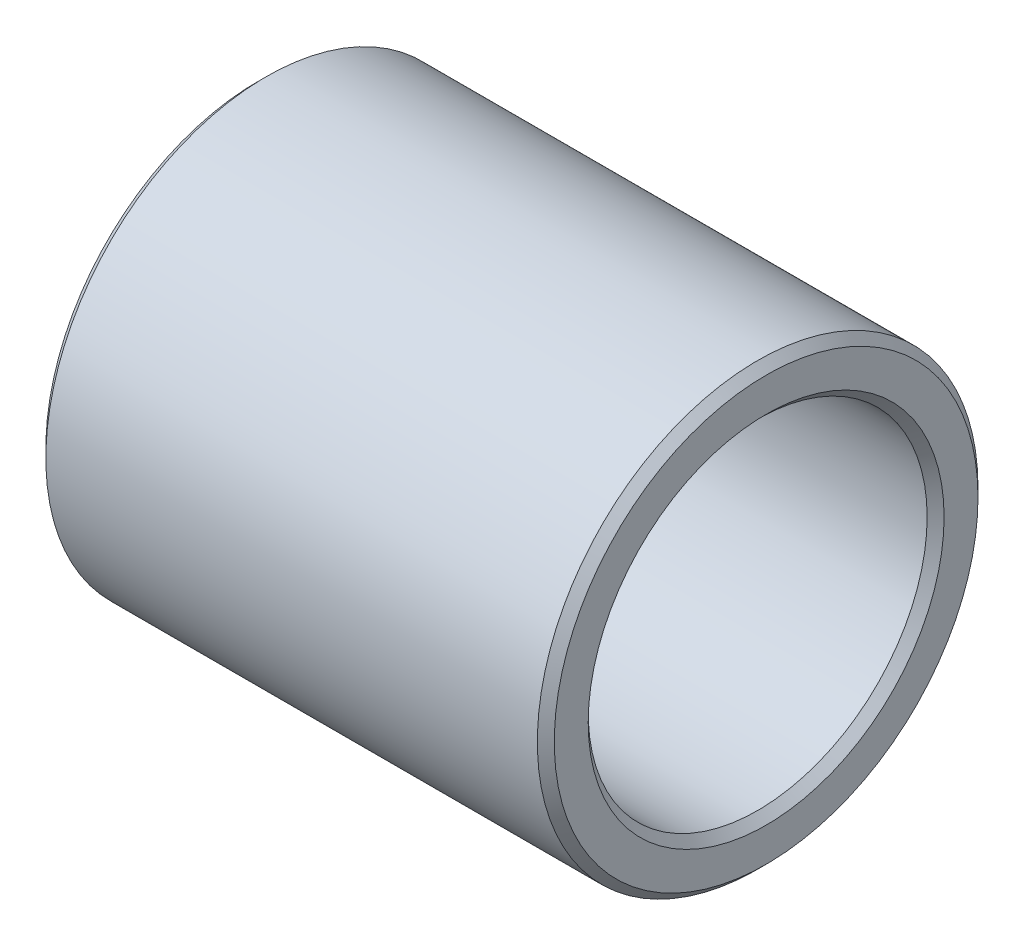
ISO-10303-21;
HEADER;
FILE_DESCRIPTION(('STEP AP214'),'2;1');
FILE_NAME('part.step','',(''),(''),'','','');
FILE_SCHEMA(('AUTOMOTIVE_DESIGN { 1 0 10303 214 1 1 1 1 }'));
ENDSEC;
DATA;
#1=APPLICATION_CONTEXT('core data for automotive mechanical design processes');
#2=APPLICATION_PROTOCOL_DEFINITION('international standard','automotive_design',2000,#1);
#3=PRODUCT_CONTEXT('',#1,'mechanical');
#4=PRODUCT('Part','Part','',(#3));
#5=PRODUCT_RELATED_PRODUCT_CATEGORY('part','',(#4));
#6=PRODUCT_DEFINITION_FORMATION('','',#4);
#7=PRODUCT_DEFINITION_CONTEXT('part definition',#1,'design');
#8=PRODUCT_DEFINITION('design','',#6,#7);
#9=PRODUCT_DEFINITION_SHAPE('','',#8);
#10=(LENGTH_UNIT() NAMED_UNIT(*) SI_UNIT(.MILLI.,.METRE.));
#11=(NAMED_UNIT(*) PLANE_ANGLE_UNIT() SI_UNIT($,.RADIAN.));
#12=(NAMED_UNIT(*) SI_UNIT($,.STERADIAN.) SOLID_ANGLE_UNIT());
#13=UNCERTAINTY_MEASURE_WITH_UNIT(LENGTH_MEASURE(1.E-05),#10,'distance_accuracy_value','');
#14=(GEOMETRIC_REPRESENTATION_CONTEXT(3) GLOBAL_UNCERTAINTY_ASSIGNED_CONTEXT((#13)) GLOBAL_UNIT_ASSIGNED_CONTEXT((#10,
#11,#12)) REPRESENTATION_CONTEXT('',''));
#15=CARTESIAN_POINT('',(0.,0.,0.));
#16=DIRECTION('',(0.,0.,1.));
#17=DIRECTION('',(1.,0.,0.));
#18=AXIS2_PLACEMENT_3D('',#15,#16,#17);
#19=CARTESIAN_POINT('',(30.,0.,0.));
#20=DIRECTION('',(1.,0.,0.));
#21=DIRECTION('',(0.,0.,-1.));
#22=AXIS2_PLACEMENT_3D('',#19,#20,#21);
#23=PLANE('',#22);
#24=CARTESIAN_POINT('',(30.,0.,0.));
#25=DIRECTION('',(1.,0.,0.));
#26=DIRECTION('',(0.,0.,-1.));
#27=AXIS2_PLACEMENT_3D('',#24,#25,#26);
#28=CIRCLE('',#27,10.5);
#29=CARTESIAN_POINT('',(30.,0.,-10.5));
#30=VERTEX_POINT('',#29);
#31=EDGE_CURVE('E45',#30,#30,#28,.F.);
#32=ORIENTED_EDGE('',*,*,#31,.T.);
#33=EDGE_LOOP('',(#32));
#34=FACE_BOUND('',#33,.T.);
#35=CARTESIAN_POINT('',(30.,0.,0.));
#36=DIRECTION('',(1.,0.,0.));
#37=DIRECTION('',(0.,0.,-1.));
#38=AXIS2_PLACEMENT_3D('',#35,#36,#37);
#39=CIRCLE('',#38,12.5);
#40=CARTESIAN_POINT('',(30.,0.,-12.5));
#41=VERTEX_POINT('',#40);
#42=EDGE_CURVE('E49',#41,#41,#39,.T.);
#43=ORIENTED_EDGE('',*,*,#42,.T.);
#44=EDGE_LOOP('',(#43));
#45=FACE_BOUND('',#44,.T.);
#46=ADVANCED_FACE('F34',(#34,#45),#23,.T.);
#47=CARTESIAN_POINT('',(0.,0.,0.));
#48=DIRECTION('',(1.,0.,0.));
#49=DIRECTION('',(0.,0.,-1.));
#50=AXIS2_PLACEMENT_3D('',#47,#48,#49);
#51=PLANE('',#50);
#52=CARTESIAN_POINT('',(0.,0.,0.));
#53=DIRECTION('',(1.,0.,0.));
#54=DIRECTION('',(0.,0.,-1.));
#55=AXIS2_PLACEMENT_3D('',#52,#53,#54);
#56=CIRCLE('',#55,10.5);
#57=CARTESIAN_POINT('',(0.,0.,-10.5));
#58=VERTEX_POINT('',#57);
#59=EDGE_CURVE('E60',#58,#58,#56,.T.);
#60=ORIENTED_EDGE('',*,*,#59,.T.);
#61=EDGE_LOOP('',(#60));
#62=FACE_BOUND('',#61,.T.);
#63=CARTESIAN_POINT('',(0.,0.,0.));
#64=DIRECTION('',(1.,0.,0.));
#65=DIRECTION('',(0.,0.,-1.));
#66=AXIS2_PLACEMENT_3D('',#63,#64,#65);
#67=CIRCLE('',#66,12.5);
#68=CARTESIAN_POINT('',(0.,0.,-12.5));
#69=VERTEX_POINT('',#68);
#70=EDGE_CURVE('E63',#69,#69,#67,.F.);
#71=ORIENTED_EDGE('',*,*,#70,.T.);
#72=EDGE_LOOP('',(#71));
#73=FACE_BOUND('',#72,.T.);
#74=ADVANCED_FACE('F67',(#62,#73),#51,.F.);
#75=CARTESIAN_POINT('',(30.,0.,0.));
#76=DIRECTION('',(-1.,0.,0.));
#77=DIRECTION('',(0.,0.,1.));
#78=AXIS2_PLACEMENT_3D('',#75,#76,#77);
#79=CYLINDRICAL_SURFACE('',#78,13.);
#80=CARTESIAN_POINT('',(0.5,0.,0.));
#81=DIRECTION('',(1.,0.,0.));
#82=DIRECTION('',(0.,0.,-1.));
#83=AXIS2_PLACEMENT_3D('',#80,#81,#82);
#84=CIRCLE('',#83,13.);
#85=CARTESIAN_POINT('',(0.5,0.,-13.));
#86=VERTEX_POINT('',#85);
#87=EDGE_CURVE('E12',#86,#86,#84,.T.);
#88=ORIENTED_EDGE('',*,*,#87,.T.);
#89=EDGE_LOOP('',(#88));
#90=FACE_BOUND('',#89,.T.);
#91=CARTESIAN_POINT('',(29.5,0.,0.));
#92=DIRECTION('',(1.,0.,0.));
#93=DIRECTION('',(0.,0.,-1.));
#94=AXIS2_PLACEMENT_3D('',#91,#92,#93);
#95=CIRCLE('',#94,13.);
#96=CARTESIAN_POINT('',(29.5,0.,-13.));
#97=VERTEX_POINT('',#96);
#98=EDGE_CURVE('E41',#97,#97,#95,.F.);
#99=ORIENTED_EDGE('',*,*,#98,.T.);
#100=EDGE_LOOP('',(#99));
#101=FACE_BOUND('',#100,.T.);
#102=ADVANCED_FACE('F87',(#90,#101),#79,.T.);
#103=CARTESIAN_POINT('',(30.,0.,0.));
#104=DIRECTION('',(-1.,0.,0.));
#105=DIRECTION('',(0.,0.,1.));
#106=AXIS2_PLACEMENT_3D('',#103,#104,#105);
#107=CYLINDRICAL_SURFACE('',#106,10.);
#108=CARTESIAN_POINT('',(0.5,0.,0.));
#109=DIRECTION('',(1.,0.,0.));
#110=DIRECTION('',(0.,0.,-1.));
#111=AXIS2_PLACEMENT_3D('',#108,#109,#110);
#112=CIRCLE('',#111,10.);
#113=CARTESIAN_POINT('',(0.5,0.,-10.));
#114=VERTEX_POINT('',#113);
#115=EDGE_CURVE('E54',#114,#114,#112,.F.);
#116=ORIENTED_EDGE('',*,*,#115,.T.);
#117=EDGE_LOOP('',(#116));
#118=FACE_BOUND('',#117,.T.);
#119=CARTESIAN_POINT('',(29.5,0.,0.));
#120=DIRECTION('',(1.,0.,0.));
#121=DIRECTION('',(0.,0.,-1.));
#122=AXIS2_PLACEMENT_3D('',#119,#120,#121);
#123=CIRCLE('',#122,10.);
#124=CARTESIAN_POINT('',(29.5,0.,-10.));
#125=VERTEX_POINT('',#124);
#126=EDGE_CURVE('E57',#125,#125,#123,.T.);
#127=ORIENTED_EDGE('',*,*,#126,.T.);
#128=EDGE_LOOP('',(#127));
#129=FACE_BOUND('',#128,.T.);
#130=ADVANCED_FACE('F92',(#118,#129),#107,.F.);
#131=CARTESIAN_POINT('',(0.,0.,0.));
#132=DIRECTION('',(-1.,0.,0.));
#133=DIRECTION('',(0.,0.,1.));
#134=AXIS2_PLACEMENT_3D('',#131,#132,#133);
#135=CONICAL_SURFACE('',#134,10.5,0.785398163397448);
#136=ORIENTED_EDGE('',*,*,#115,.F.);
#137=EDGE_LOOP('',(#136));
#138=FACE_BOUND('',#137,.T.);
#139=ORIENTED_EDGE('',*,*,#59,.F.);
#140=EDGE_LOOP('',(#139));
#141=FACE_BOUND('',#140,.T.);
#142=ADVANCED_FACE('F78',(#138,#141),#135,.F.);
#143=CARTESIAN_POINT('',(29.5,0.,0.));
#144=DIRECTION('',(1.,0.,0.));
#145=DIRECTION('',(0.,0.,-1.));
#146=AXIS2_PLACEMENT_3D('',#143,#144,#145);
#147=CONICAL_SURFACE('',#146,10.,0.785398163397448);
#148=ORIENTED_EDGE('',*,*,#31,.F.);
#149=EDGE_LOOP('',(#148));
#150=FACE_BOUND('',#149,.T.);
#151=ORIENTED_EDGE('',*,*,#126,.F.);
#152=EDGE_LOOP('',(#151));
#153=FACE_BOUND('',#152,.T.);
#154=ADVANCED_FACE('F72',(#150,#153),#147,.F.);
#155=CARTESIAN_POINT('',(0.5,0.,0.));
#156=DIRECTION('',(1.,0.,0.));
#157=DIRECTION('',(0.,0.,-1.));
#158=AXIS2_PLACEMENT_3D('',#155,#156,#157);
#159=CONICAL_SURFACE('',#158,13.,0.785398163397448);
#160=ORIENTED_EDGE('',*,*,#70,.F.);
#161=EDGE_LOOP('',(#160));
#162=FACE_BOUND('',#161,.T.);
#163=ORIENTED_EDGE('',*,*,#87,.F.);
#164=EDGE_LOOP('',(#163));
#165=FACE_BOUND('',#164,.T.);
#166=ADVANCED_FACE('F69',(#162,#165),#159,.T.);
#167=CARTESIAN_POINT('',(30.,0.,0.));
#168=DIRECTION('',(-1.,0.,0.));
#169=DIRECTION('',(0.,0.,1.));
#170=AXIS2_PLACEMENT_3D('',#167,#168,#169);
#171=CONICAL_SURFACE('',#170,12.5,0.785398163397448);
#172=ORIENTED_EDGE('',*,*,#98,.F.);
#173=EDGE_LOOP('',(#172));
#174=FACE_BOUND('',#173,.T.);
#175=ORIENTED_EDGE('',*,*,#42,.F.);
#176=EDGE_LOOP('',(#175));
#177=FACE_BOUND('',#176,.T.);
#178=ADVANCED_FACE('F36',(#174,#177),#171,.T.);
#179=CLOSED_SHELL('',(#46,#74,#102,#130,#142,#154,#166,#178));
#180=MANIFOLD_SOLID_BREP('B2',#179);
#181=ADVANCED_BREP_SHAPE_REPRESENTATION('',(#18,#180),#14);
#182=SHAPE_DEFINITION_REPRESENTATION(#9,#181);
ENDSEC;
END-ISO-10303-21;
